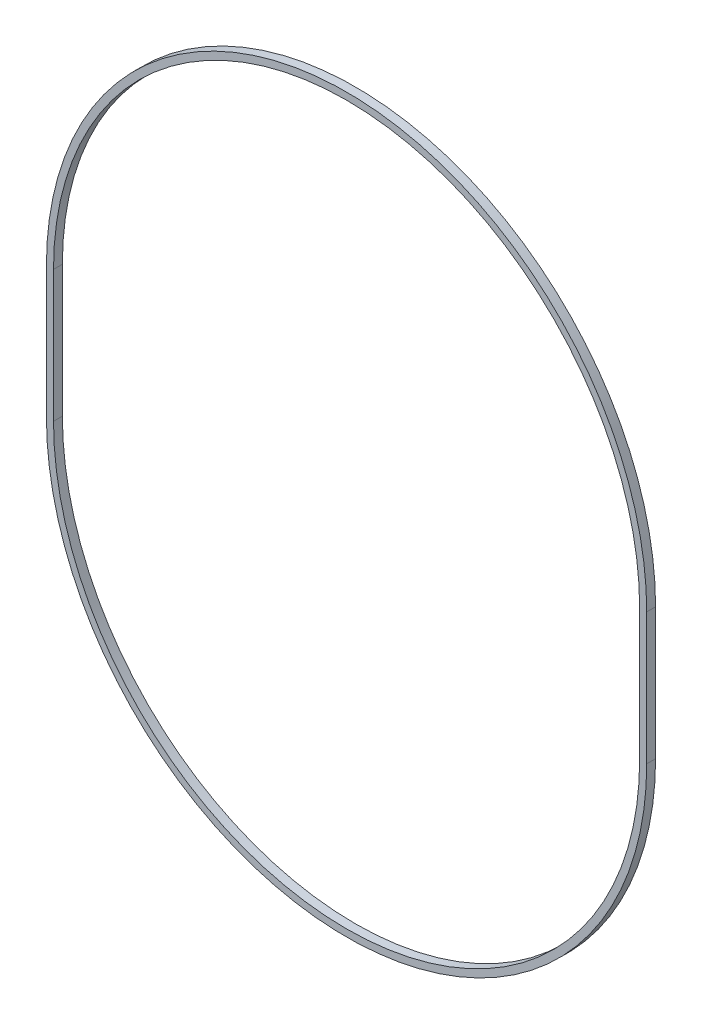
ISO-10303-21;
HEADER;
FILE_DESCRIPTION(('STEP AP214'),'2;1');
FILE_NAME('part.step','',(''),(''),'','','');
FILE_SCHEMA(('AUTOMOTIVE_DESIGN { 1 0 10303 214 1 1 1 1 }'));
ENDSEC;
DATA;
#1=APPLICATION_CONTEXT('core data for automotive mechanical design processes');
#2=APPLICATION_PROTOCOL_DEFINITION('international standard','automotive_design',2000,#1);
#3=PRODUCT_CONTEXT('',#1,'mechanical');
#4=PRODUCT('Part','Part','',(#3));
#5=PRODUCT_RELATED_PRODUCT_CATEGORY('part','',(#4));
#6=PRODUCT_DEFINITION_FORMATION('','',#4);
#7=PRODUCT_DEFINITION_CONTEXT('part definition',#1,'design');
#8=PRODUCT_DEFINITION('design','',#6,#7);
#9=PRODUCT_DEFINITION_SHAPE('','',#8);
#10=(LENGTH_UNIT() NAMED_UNIT(*) SI_UNIT(.MILLI.,.METRE.));
#11=(NAMED_UNIT(*) PLANE_ANGLE_UNIT() SI_UNIT($,.RADIAN.));
#12=(NAMED_UNIT(*) SI_UNIT($,.STERADIAN.) SOLID_ANGLE_UNIT());
#13=UNCERTAINTY_MEASURE_WITH_UNIT(LENGTH_MEASURE(1.E-05),#10,'distance_accuracy_value','');
#14=(GEOMETRIC_REPRESENTATION_CONTEXT(3) GLOBAL_UNCERTAINTY_ASSIGNED_CONTEXT((#13)) GLOBAL_UNIT_ASSIGNED_CONTEXT((#10,
#11,#12)) REPRESENTATION_CONTEXT('',''));
#15=CARTESIAN_POINT('',(0.,0.,0.));
#16=DIRECTION('',(0.,0.,1.));
#17=DIRECTION('',(1.,0.,0.));
#18=AXIS2_PLACEMENT_3D('',#15,#16,#17);
#19=CARTESIAN_POINT('',(-127.19,0.,1.875));
#20=DIRECTION('',(1.,0.,0.));
#21=DIRECTION('',(0.,0.,-1.));
#22=AXIS2_PLACEMENT_3D('',#19,#20,#21);
#23=PLANE('',#22);
#24=DIRECTION('',(0.,-1.,0.));
#25=VECTOR('',#24,1.);
#26=CARTESIAN_POINT('',(-127.19,0.,-1.875));
#27=LINE('',#26,#25);
#28=CARTESIAN_POINT('',(-127.19,27.875,-1.875));
#29=VERTEX_POINT('',#28);
#30=CARTESIAN_POINT('',(-127.19,-27.875,-1.875));
#31=VERTEX_POINT('',#30);
#32=EDGE_CURVE('E152',#29,#31,#27,.T.);
#33=ORIENTED_EDGE('',*,*,#32,.T.);
#34=DIRECTION('',(0.,0.,-1.));
#35=VECTOR('',#34,1.);
#36=CARTESIAN_POINT('',(-127.19,-27.875,1.875));
#37=LINE('',#36,#35);
#38=CARTESIAN_POINT('',(-127.19,-27.875,1.875));
#39=VERTEX_POINT('',#38);
#40=EDGE_CURVE('E11',#39,#31,#37,.T.);
#41=ORIENTED_EDGE('',*,*,#40,.F.);
#42=DIRECTION('',(0.,-1.,0.));
#43=VECTOR('',#42,1.);
#44=CARTESIAN_POINT('',(-127.19,0.,1.875));
#45=LINE('',#44,#43);
#46=CARTESIAN_POINT('',(-127.19,27.875,1.875));
#47=VERTEX_POINT('',#46);
#48=EDGE_CURVE('E126',#47,#39,#45,.T.);
#49=ORIENTED_EDGE('',*,*,#48,.F.);
#50=DIRECTION('',(0.,0.,-1.));
#51=VECTOR('',#50,1.);
#52=CARTESIAN_POINT('',(-127.19,27.875,1.875));
#53=LINE('',#52,#51);
#54=EDGE_CURVE('E159',#47,#29,#53,.T.);
#55=ORIENTED_EDGE('',*,*,#54,.T.);
#56=EDGE_LOOP('',(#33,#41,#49,#55));
#57=FACE_BOUND('',#56,.T.);
#58=ADVANCED_FACE('F45',(#57),#23,.F.);
#59=CARTESIAN_POINT('',(0.,-27.875,1.875));
#60=DIRECTION('',(0.,0.,-1.));
#61=DIRECTION('',(-1.,0.,0.));
#62=AXIS2_PLACEMENT_3D('',#59,#60,#61);
#63=CYLINDRICAL_SURFACE('',#62,127.19);
#64=CARTESIAN_POINT('',(0.,-27.875,-1.875));
#65=DIRECTION('',(0.,0.,1.));
#66=DIRECTION('',(1.,0.,0.));
#67=AXIS2_PLACEMENT_3D('',#64,#65,#66);
#68=CIRCLE('',#67,127.19);
#69=CARTESIAN_POINT('',(127.19,-27.875,-1.875));
#70=VERTEX_POINT('',#69);
#71=EDGE_CURVE('E131',#31,#70,#68,.T.);
#72=ORIENTED_EDGE('',*,*,#71,.T.);
#73=DIRECTION('',(0.,0.,-1.));
#74=VECTOR('',#73,1.);
#75=CARTESIAN_POINT('',(127.19,-27.875,1.875));
#76=LINE('',#75,#74);
#77=CARTESIAN_POINT('',(127.19,-27.875,1.875));
#78=VERTEX_POINT('',#77);
#79=EDGE_CURVE('E55',#78,#70,#76,.T.);
#80=ORIENTED_EDGE('',*,*,#79,.F.);
#81=CARTESIAN_POINT('',(0.,-27.875,1.875));
#82=DIRECTION('',(0.,0.,1.));
#83=DIRECTION('',(1.,0.,0.));
#84=AXIS2_PLACEMENT_3D('',#81,#82,#83);
#85=CIRCLE('',#84,127.19);
#86=EDGE_CURVE('E120',#39,#78,#85,.T.);
#87=ORIENTED_EDGE('',*,*,#86,.F.);
#88=ORIENTED_EDGE('',*,*,#40,.T.);
#89=EDGE_LOOP('',(#72,#80,#87,#88));
#90=FACE_BOUND('',#89,.T.);
#91=ADVANCED_FACE('F130',(#90),#63,.T.);
#92=CARTESIAN_POINT('',(127.19,0.,1.875));
#93=DIRECTION('',(-1.,0.,0.));
#94=DIRECTION('',(0.,0.,1.));
#95=AXIS2_PLACEMENT_3D('',#92,#93,#94);
#96=PLANE('',#95);
#97=DIRECTION('',(0.,1.,0.));
#98=VECTOR('',#97,1.);
#99=CARTESIAN_POINT('',(127.19,0.,-1.875));
#100=LINE('',#99,#98);
#101=CARTESIAN_POINT('',(127.19,27.875,-1.875));
#102=VERTEX_POINT('',#101);
#103=EDGE_CURVE('E93',#70,#102,#100,.T.);
#104=ORIENTED_EDGE('',*,*,#103,.T.);
#105=DIRECTION('',(0.,0.,-1.));
#106=VECTOR('',#105,1.);
#107=CARTESIAN_POINT('',(127.19,27.875,1.875));
#108=LINE('',#107,#106);
#109=CARTESIAN_POINT('',(127.19,27.875,1.875));
#110=VERTEX_POINT('',#109);
#111=EDGE_CURVE('E132',#110,#102,#108,.T.);
#112=ORIENTED_EDGE('',*,*,#111,.F.);
#113=DIRECTION('',(0.,1.,0.));
#114=VECTOR('',#113,1.);
#115=CARTESIAN_POINT('',(127.19,0.,1.875));
#116=LINE('',#115,#114);
#117=EDGE_CURVE('E124',#78,#110,#116,.T.);
#118=ORIENTED_EDGE('',*,*,#117,.F.);
#119=ORIENTED_EDGE('',*,*,#79,.T.);
#120=EDGE_LOOP('',(#104,#112,#118,#119));
#121=FACE_BOUND('',#120,.T.);
#122=ADVANCED_FACE('F134',(#121),#96,.F.);
#123=CARTESIAN_POINT('',(0.,27.875,1.875));
#124=DIRECTION('',(0.,0.,-1.));
#125=DIRECTION('',(-1.,0.,0.));
#126=AXIS2_PLACEMENT_3D('',#123,#124,#125);
#127=CYLINDRICAL_SURFACE('',#126,124.19);
#128=CARTESIAN_POINT('',(0.,27.875,-1.875));
#129=DIRECTION('',(0.,0.,1.));
#130=DIRECTION('',(1.,0.,0.));
#131=AXIS2_PLACEMENT_3D('',#128,#129,#130);
#132=CIRCLE('',#131,124.19);
#133=CARTESIAN_POINT('',(124.19,27.875,-1.875));
#134=VERTEX_POINT('',#133);
#135=CARTESIAN_POINT('',(-124.19,27.875,-1.875));
#136=VERTEX_POINT('',#135);
#137=EDGE_CURVE('E140',#134,#136,#132,.T.);
#138=ORIENTED_EDGE('',*,*,#137,.F.);
#139=DIRECTION('',(0.,0.,-1.));
#140=VECTOR('',#139,1.);
#141=CARTESIAN_POINT('',(124.19,27.875,1.875));
#142=LINE('',#141,#140);
#143=CARTESIAN_POINT('',(124.19,27.875,1.875));
#144=VERTEX_POINT('',#143);
#145=EDGE_CURVE('E49',#144,#134,#142,.T.);
#146=ORIENTED_EDGE('',*,*,#145,.F.);
#147=CARTESIAN_POINT('',(0.,27.875,1.875));
#148=DIRECTION('',(0.,0.,1.));
#149=DIRECTION('',(1.,0.,0.));
#150=AXIS2_PLACEMENT_3D('',#147,#148,#149);
#151=CIRCLE('',#150,124.19);
#152=CARTESIAN_POINT('',(-124.19,27.875,1.875));
#153=VERTEX_POINT('',#152);
#154=EDGE_CURVE('E158',#144,#153,#151,.T.);
#155=ORIENTED_EDGE('',*,*,#154,.T.);
#156=DIRECTION('',(0.,0.,-1.));
#157=VECTOR('',#156,1.);
#158=CARTESIAN_POINT('',(-124.19,27.875,1.875));
#159=LINE('',#158,#157);
#160=EDGE_CURVE('E136',#153,#136,#159,.T.);
#161=ORIENTED_EDGE('',*,*,#160,.T.);
#162=EDGE_LOOP('',(#138,#146,#155,#161));
#163=FACE_BOUND('',#162,.T.);
#164=ADVANCED_FACE('F47',(#163),#127,.F.);
#165=CARTESIAN_POINT('',(124.19,0.,1.875));
#166=DIRECTION('',(-1.,0.,0.));
#167=DIRECTION('',(0.,0.,1.));
#168=AXIS2_PLACEMENT_3D('',#165,#166,#167);
#169=PLANE('',#168);
#170=DIRECTION('',(0.,1.,0.));
#171=VECTOR('',#170,1.);
#172=CARTESIAN_POINT('',(124.19,0.,-1.875));
#173=LINE('',#172,#171);
#174=CARTESIAN_POINT('',(124.19,-27.875,-1.875));
#175=VERTEX_POINT('',#174);
#176=EDGE_CURVE('E143',#175,#134,#173,.T.);
#177=ORIENTED_EDGE('',*,*,#176,.F.);
#178=DIRECTION('',(0.,0.,-1.));
#179=VECTOR('',#178,1.);
#180=CARTESIAN_POINT('',(124.19,-27.875,1.875));
#181=LINE('',#180,#179);
#182=CARTESIAN_POINT('',(124.19,-27.875,1.875));
#183=VERTEX_POINT('',#182);
#184=EDGE_CURVE('E164',#183,#175,#181,.T.);
#185=ORIENTED_EDGE('',*,*,#184,.F.);
#186=DIRECTION('',(0.,1.,0.));
#187=VECTOR('',#186,1.);
#188=CARTESIAN_POINT('',(124.19,0.,1.875));
#189=LINE('',#188,#187);
#190=EDGE_CURVE('E173',#183,#144,#189,.T.);
#191=ORIENTED_EDGE('',*,*,#190,.T.);
#192=ORIENTED_EDGE('',*,*,#145,.T.);
#193=EDGE_LOOP('',(#177,#185,#191,#192));
#194=FACE_BOUND('',#193,.T.);
#195=ADVANCED_FACE('F171',(#194),#169,.T.);
#196=CARTESIAN_POINT('',(0.,-27.875,1.875));
#197=DIRECTION('',(0.,0.,-1.));
#198=DIRECTION('',(-1.,0.,0.));
#199=AXIS2_PLACEMENT_3D('',#196,#197,#198);
#200=CYLINDRICAL_SURFACE('',#199,124.19);
#201=CARTESIAN_POINT('',(0.,-27.875,-1.875));
#202=DIRECTION('',(0.,0.,1.));
#203=DIRECTION('',(1.,0.,0.));
#204=AXIS2_PLACEMENT_3D('',#201,#202,#203);
#205=CIRCLE('',#204,124.19);
#206=CARTESIAN_POINT('',(-124.19,-27.875,-1.875));
#207=VERTEX_POINT('',#206);
#208=EDGE_CURVE('E146',#207,#175,#205,.T.);
#209=ORIENTED_EDGE('',*,*,#208,.F.);
#210=DIRECTION('',(0.,0.,-1.));
#211=VECTOR('',#210,1.);
#212=CARTESIAN_POINT('',(-124.19,-27.875,1.875));
#213=LINE('',#212,#211);
#214=CARTESIAN_POINT('',(-124.19,-27.875,1.875));
#215=VERTEX_POINT('',#214);
#216=EDGE_CURVE('E163',#215,#207,#213,.T.);
#217=ORIENTED_EDGE('',*,*,#216,.F.);
#218=CARTESIAN_POINT('',(0.,-27.875,1.875));
#219=DIRECTION('',(0.,0.,1.));
#220=DIRECTION('',(1.,0.,0.));
#221=AXIS2_PLACEMENT_3D('',#218,#219,#220);
#222=CIRCLE('',#221,124.19);
#223=EDGE_CURVE('E180',#215,#183,#222,.T.);
#224=ORIENTED_EDGE('',*,*,#223,.T.);
#225=ORIENTED_EDGE('',*,*,#184,.T.);
#226=EDGE_LOOP('',(#209,#217,#224,#225));
#227=FACE_BOUND('',#226,.T.);
#228=ADVANCED_FACE('F178',(#227),#200,.F.);
#229=CARTESIAN_POINT('',(-124.19,0.,1.875));
#230=DIRECTION('',(1.,0.,0.));
#231=DIRECTION('',(0.,1.,0.));
#232=AXIS2_PLACEMENT_3D('',#229,#230,#231);
#233=PLANE('',#232);
#234=DIRECTION('',(0.,-1.,0.));
#235=VECTOR('',#234,1.);
#236=CARTESIAN_POINT('',(-124.19,0.,-1.875));
#237=LINE('',#236,#235);
#238=EDGE_CURVE('E149',#136,#207,#237,.T.);
#239=ORIENTED_EDGE('',*,*,#238,.F.);
#240=ORIENTED_EDGE('',*,*,#160,.F.);
#241=DIRECTION('',(0.,-1.,0.));
#242=VECTOR('',#241,1.);
#243=CARTESIAN_POINT('',(-124.19,0.,1.875));
#244=LINE('',#243,#242);
#245=EDGE_CURVE('E185',#153,#215,#244,.T.);
#246=ORIENTED_EDGE('',*,*,#245,.T.);
#247=ORIENTED_EDGE('',*,*,#216,.T.);
#248=EDGE_LOOP('',(#239,#240,#246,#247));
#249=FACE_BOUND('',#248,.T.);
#250=ADVANCED_FACE('F187',(#249),#233,.T.);
#251=CARTESIAN_POINT('',(0.,27.875,1.875));
#252=DIRECTION('',(0.,0.,-1.));
#253=DIRECTION('',(-1.,0.,0.));
#254=AXIS2_PLACEMENT_3D('',#251,#252,#253);
#255=CYLINDRICAL_SURFACE('',#254,127.19);
#256=CARTESIAN_POINT('',(0.,27.875,-1.875));
#257=DIRECTION('',(0.,0.,1.));
#258=DIRECTION('',(1.,0.,0.));
#259=AXIS2_PLACEMENT_3D('',#256,#257,#258);
#260=CIRCLE('',#259,127.19);
#261=EDGE_CURVE('E99',#102,#29,#260,.T.);
#262=ORIENTED_EDGE('',*,*,#261,.T.);
#263=ORIENTED_EDGE('',*,*,#54,.F.);
#264=CARTESIAN_POINT('',(0.,27.875,1.875));
#265=DIRECTION('',(0.,0.,1.));
#266=DIRECTION('',(1.,0.,0.));
#267=AXIS2_PLACEMENT_3D('',#264,#265,#266);
#268=CIRCLE('',#267,127.19);
#269=EDGE_CURVE('E64',#110,#47,#268,.T.);
#270=ORIENTED_EDGE('',*,*,#269,.F.);
#271=ORIENTED_EDGE('',*,*,#111,.T.);
#272=EDGE_LOOP('',(#262,#263,#270,#271));
#273=FACE_BOUND('',#272,.T.);
#274=ADVANCED_FACE('F192',(#273),#255,.T.);
#275=CARTESIAN_POINT('',(0.,0.,1.875));
#276=DIRECTION('',(0.,0.,1.));
#277=DIRECTION('',(1.,0.,0.));
#278=AXIS2_PLACEMENT_3D('',#275,#276,#277);
#279=PLANE('',#278);
#280=ORIENTED_EDGE('',*,*,#154,.F.);
#281=ORIENTED_EDGE('',*,*,#190,.F.);
#282=ORIENTED_EDGE('',*,*,#223,.F.);
#283=ORIENTED_EDGE('',*,*,#245,.F.);
#284=EDGE_LOOP('',(#280,#281,#282,#283));
#285=FACE_BOUND('',#284,.T.);
#286=ORIENTED_EDGE('',*,*,#48,.T.);
#287=ORIENTED_EDGE('',*,*,#86,.T.);
#288=ORIENTED_EDGE('',*,*,#117,.T.);
#289=ORIENTED_EDGE('',*,*,#269,.T.);
#290=EDGE_LOOP('',(#286,#287,#288,#289));
#291=FACE_BOUND('',#290,.T.);
#292=ADVANCED_FACE('F122',(#285,#291),#279,.T.);
#293=CARTESIAN_POINT('',(0.,0.,-1.875));
#294=DIRECTION('',(0.,0.,1.));
#295=DIRECTION('',(1.,0.,0.));
#296=AXIS2_PLACEMENT_3D('',#293,#294,#295);
#297=PLANE('',#296);
#298=ORIENTED_EDGE('',*,*,#137,.T.);
#299=ORIENTED_EDGE('',*,*,#238,.T.);
#300=ORIENTED_EDGE('',*,*,#208,.T.);
#301=ORIENTED_EDGE('',*,*,#176,.T.);
#302=EDGE_LOOP('',(#298,#299,#300,#301));
#303=FACE_BOUND('',#302,.T.);
#304=ORIENTED_EDGE('',*,*,#32,.F.);
#305=ORIENTED_EDGE('',*,*,#261,.F.);
#306=ORIENTED_EDGE('',*,*,#103,.F.);
#307=ORIENTED_EDGE('',*,*,#71,.F.);
#308=EDGE_LOOP('',(#304,#305,#306,#307));
#309=FACE_BOUND('',#308,.T.);
#310=ADVANCED_FACE('F176',(#303,#309),#297,.F.);
#311=CLOSED_SHELL('',(#58,#91,#122,#164,#195,#228,#250,#274,#292,#310));
#312=MANIFOLD_SOLID_BREP('B2',#311);
#313=ADVANCED_BREP_SHAPE_REPRESENTATION('',(#18,#312),#14);
#314=SHAPE_DEFINITION_REPRESENTATION(#9,#313);
ENDSEC;
END-ISO-10303-21;
